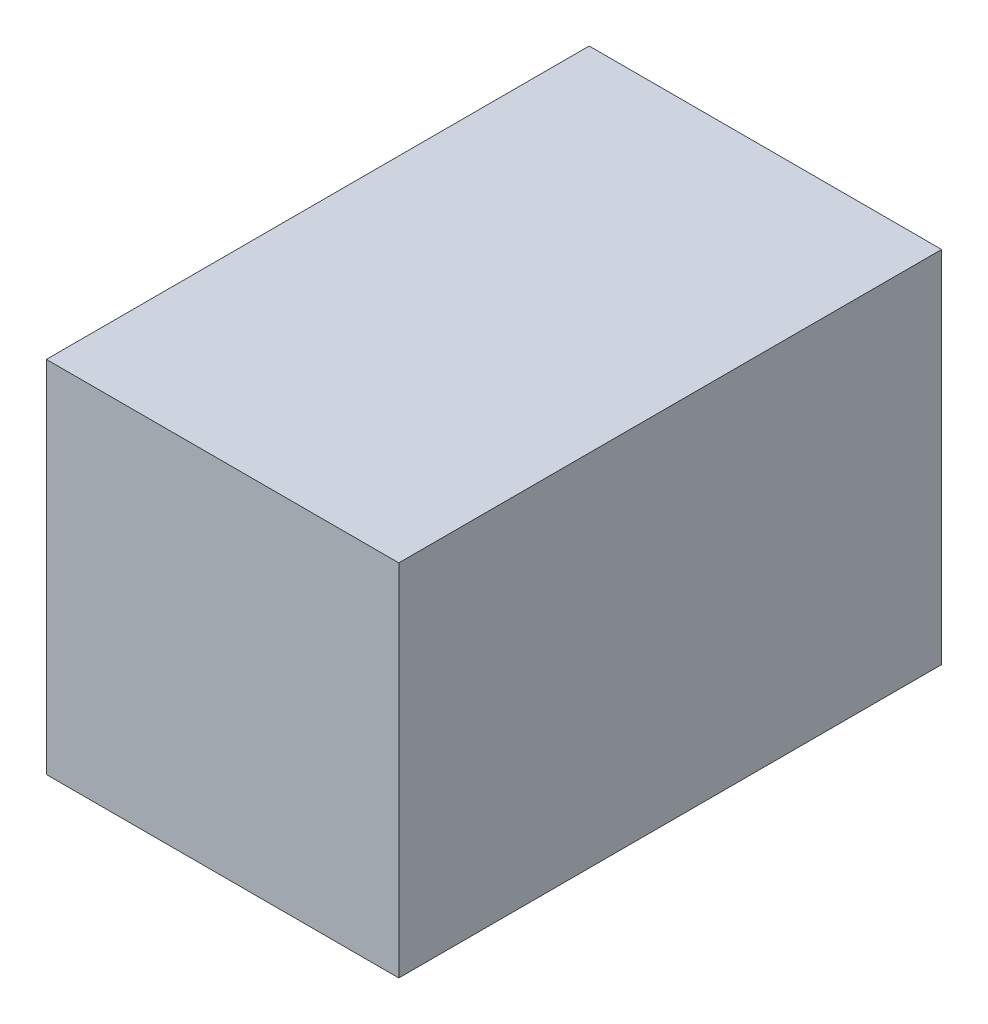
ISO-10303-21;
HEADER;
FILE_DESCRIPTION(('STEP AP214'),'2;1');
FILE_NAME('part.step','',(''),(''),'','','');
FILE_SCHEMA(('AUTOMOTIVE_DESIGN { 1 0 10303 214 1 1 1 1 }'));
ENDSEC;
DATA;
#1=APPLICATION_CONTEXT('core data for automotive mechanical design processes');
#2=APPLICATION_PROTOCOL_DEFINITION('international standard','automotive_design',2000,#1);
#3=PRODUCT_CONTEXT('',#1,'mechanical');
#4=PRODUCT('Part','Part','',(#3));
#5=PRODUCT_RELATED_PRODUCT_CATEGORY('part','',(#4));
#6=PRODUCT_DEFINITION_FORMATION('','',#4);
#7=PRODUCT_DEFINITION_CONTEXT('part definition',#1,'design');
#8=PRODUCT_DEFINITION('design','',#6,#7);
#9=PRODUCT_DEFINITION_SHAPE('','',#8);
#10=(LENGTH_UNIT() NAMED_UNIT(*) SI_UNIT(.MILLI.,.METRE.));
#11=(NAMED_UNIT(*) PLANE_ANGLE_UNIT() SI_UNIT($,.RADIAN.));
#12=(NAMED_UNIT(*) SI_UNIT($,.STERADIAN.) SOLID_ANGLE_UNIT());
#13=UNCERTAINTY_MEASURE_WITH_UNIT(LENGTH_MEASURE(1.E-05),#10,'distance_accuracy_value','');
#14=(GEOMETRIC_REPRESENTATION_CONTEXT(3) GLOBAL_UNCERTAINTY_ASSIGNED_CONTEXT((#13)) GLOBAL_UNIT_ASSIGNED_CONTEXT((#10,
#11,#12)) REPRESENTATION_CONTEXT('',''));
#15=CARTESIAN_POINT('',(0.,0.,0.));
#16=DIRECTION('',(0.,0.,1.));
#17=DIRECTION('',(1.,0.,0.));
#18=AXIS2_PLACEMENT_3D('',#15,#16,#17);
#19=CARTESIAN_POINT('',(-12.2,32.75,-53.6));
#20=DIRECTION('',(0.,0.,-1.));
#21=DIRECTION('',(-1.,0.,0.));
#22=AXIS2_PLACEMENT_3D('',#19,#20,#21);
#23=PLANE('',#22);
#24=DIRECTION('',(0.,-1.,0.));
#25=VECTOR('',#24,1.);
#26=CARTESIAN_POINT('',(-17.4,32.75,-53.6));
#27=LINE('',#26,#25);
#28=CARTESIAN_POINT('',(-17.4,32.75,-53.6));
#29=VERTEX_POINT('',#28);
#30=CARTESIAN_POINT('',(-17.4,-2.75,-53.6));
#31=VERTEX_POINT('',#30);
#32=EDGE_CURVE('E53',#29,#31,#27,.T.);
#33=ORIENTED_EDGE('',*,*,#32,.F.);
#34=DIRECTION('',(-1.,0.,0.));
#35=VECTOR('',#34,1.);
#36=CARTESIAN_POINT('',(17.4,32.75,-53.6));
#37=LINE('',#36,#35);
#38=CARTESIAN_POINT('',(17.4,32.75,-53.6));
#39=VERTEX_POINT('',#38);
#40=EDGE_CURVE('E76',#39,#29,#37,.T.);
#41=ORIENTED_EDGE('',*,*,#40,.F.);
#42=DIRECTION('',(0.,1.,0.));
#43=VECTOR('',#42,1.);
#44=CARTESIAN_POINT('',(17.4,-2.75,-53.6));
#45=LINE('',#44,#43);
#46=CARTESIAN_POINT('',(17.4,-2.75,-53.6));
#47=VERTEX_POINT('',#46);
#48=EDGE_CURVE('E81',#47,#39,#45,.T.);
#49=ORIENTED_EDGE('',*,*,#48,.F.);
#50=DIRECTION('',(1.,0.,0.));
#51=VECTOR('',#50,1.);
#52=CARTESIAN_POINT('',(-17.4,-2.75,-53.6));
#53=LINE('',#52,#51);
#54=EDGE_CURVE('E96',#31,#47,#53,.T.);
#55=ORIENTED_EDGE('',*,*,#54,.F.);
#56=EDGE_LOOP('',(#33,#41,#49,#55));
#57=FACE_BOUND('',#56,.T.);
#58=ADVANCED_FACE('F45',(#57),#23,.T.);
#59=CARTESIAN_POINT('',(0.,0.,0.));
#60=DIRECTION('',(0.,0.,1.));
#61=DIRECTION('',(1.,0.,0.));
#62=AXIS2_PLACEMENT_3D('',#59,#60,#61);
#63=PLANE('',#62);
#64=DIRECTION('',(0.,-1.,0.));
#65=VECTOR('',#64,1.);
#66=CARTESIAN_POINT('',(-17.4,32.75,0.));
#67=LINE('',#66,#65);
#68=CARTESIAN_POINT('',(-17.4,32.75,0.));
#69=VERTEX_POINT('',#68);
#70=CARTESIAN_POINT('',(-17.4,-2.75,0.));
#71=VERTEX_POINT('',#70);
#72=EDGE_CURVE('E105',#69,#71,#67,.T.);
#73=ORIENTED_EDGE('',*,*,#72,.T.);
#74=DIRECTION('',(1.,0.,0.));
#75=VECTOR('',#74,1.);
#76=CARTESIAN_POINT('',(-17.4,-2.75,0.));
#77=LINE('',#76,#75);
#78=CARTESIAN_POINT('',(17.4,-2.75,0.));
#79=VERTEX_POINT('',#78);
#80=EDGE_CURVE('E94',#71,#79,#77,.T.);
#81=ORIENTED_EDGE('',*,*,#80,.T.);
#82=DIRECTION('',(0.,1.,0.));
#83=VECTOR('',#82,1.);
#84=CARTESIAN_POINT('',(17.4,-2.75,0.));
#85=LINE('',#84,#83);
#86=CARTESIAN_POINT('',(17.4,32.75,0.));
#87=VERTEX_POINT('',#86);
#88=EDGE_CURVE('E97',#79,#87,#85,.T.);
#89=ORIENTED_EDGE('',*,*,#88,.T.);
#90=DIRECTION('',(-1.,0.,0.));
#91=VECTOR('',#90,1.);
#92=CARTESIAN_POINT('',(17.4,32.75,0.));
#93=LINE('',#92,#91);
#94=EDGE_CURVE('E102',#87,#69,#93,.T.);
#95=ORIENTED_EDGE('',*,*,#94,.T.);
#96=EDGE_LOOP('',(#73,#81,#89,#95));
#97=FACE_BOUND('',#96,.T.);
#98=ADVANCED_FACE('F104',(#97),#63,.T.);
#99=CARTESIAN_POINT('',(-17.4,-2.75,-103.31207096873));
#100=DIRECTION('',(0.,-1.,0.));
#101=DIRECTION('',(0.,0.,-1.));
#102=AXIS2_PLACEMENT_3D('',#99,#100,#101);
#103=PLANE('',#102);
#104=DIRECTION('',(0.,0.,1.));
#105=VECTOR('',#104,1.);
#106=CARTESIAN_POINT('',(-17.4,-2.75,-103.31207096873));
#107=LINE('',#106,#105);
#108=EDGE_CURVE('E11',#31,#71,#107,.T.);
#109=ORIENTED_EDGE('',*,*,#108,.F.);
#110=ORIENTED_EDGE('',*,*,#54,.T.);
#111=DIRECTION('',(0.,0.,1.));
#112=VECTOR('',#111,1.);
#113=CARTESIAN_POINT('',(17.4,-2.75,-103.31207096873));
#114=LINE('',#113,#112);
#115=EDGE_CURVE('E91',#47,#79,#114,.T.);
#116=ORIENTED_EDGE('',*,*,#115,.T.);
#117=ORIENTED_EDGE('',*,*,#80,.F.);
#118=EDGE_LOOP('',(#109,#110,#116,#117));
#119=FACE_BOUND('',#118,.T.);
#120=ADVANCED_FACE('F92',(#119),#103,.T.);
#121=CARTESIAN_POINT('',(17.4,-2.75,-103.31207096873));
#122=DIRECTION('',(1.,0.,0.));
#123=DIRECTION('',(0.,0.,-1.));
#124=AXIS2_PLACEMENT_3D('',#121,#122,#123);
#125=PLANE('',#124);
#126=ORIENTED_EDGE('',*,*,#115,.F.);
#127=ORIENTED_EDGE('',*,*,#48,.T.);
#128=DIRECTION('',(0.,0.,1.));
#129=VECTOR('',#128,1.);
#130=CARTESIAN_POINT('',(17.4,32.75,-103.31207096873));
#131=LINE('',#130,#129);
#132=EDGE_CURVE('E86',#39,#87,#131,.T.);
#133=ORIENTED_EDGE('',*,*,#132,.T.);
#134=ORIENTED_EDGE('',*,*,#88,.F.);
#135=EDGE_LOOP('',(#126,#127,#133,#134));
#136=FACE_BOUND('',#135,.T.);
#137=ADVANCED_FACE('F98',(#136),#125,.T.);
#138=CARTESIAN_POINT('',(17.4,32.75,-103.31207096873));
#139=DIRECTION('',(0.,1.,0.));
#140=DIRECTION('',(0.,0.,1.));
#141=AXIS2_PLACEMENT_3D('',#138,#139,#140);
#142=PLANE('',#141);
#143=ORIENTED_EDGE('',*,*,#132,.F.);
#144=ORIENTED_EDGE('',*,*,#40,.T.);
#145=DIRECTION('',(0.,0.,1.));
#146=VECTOR('',#145,1.);
#147=CARTESIAN_POINT('',(-17.4,32.75,-103.31207096873));
#148=LINE('',#147,#146);
#149=EDGE_CURVE('E112',#29,#69,#148,.T.);
#150=ORIENTED_EDGE('',*,*,#149,.T.);
#151=ORIENTED_EDGE('',*,*,#94,.F.);
#152=EDGE_LOOP('',(#143,#144,#150,#151));
#153=FACE_BOUND('',#152,.T.);
#154=ADVANCED_FACE('F118',(#153),#142,.T.);
#155=CARTESIAN_POINT('',(-17.4,32.75,-103.31207096873));
#156=DIRECTION('',(-1.,0.,0.));
#157=DIRECTION('',(0.,0.,1.));
#158=AXIS2_PLACEMENT_3D('',#155,#156,#157);
#159=PLANE('',#158);
#160=ORIENTED_EDGE('',*,*,#149,.F.);
#161=ORIENTED_EDGE('',*,*,#32,.T.);
#162=ORIENTED_EDGE('',*,*,#108,.T.);
#163=ORIENTED_EDGE('',*,*,#72,.F.);
#164=EDGE_LOOP('',(#160,#161,#162,#163));
#165=FACE_BOUND('',#164,.T.);
#166=ADVANCED_FACE('F119',(#165),#159,.T.);
#167=CLOSED_SHELL('',(#58,#98,#120,#137,#154,#166));
#168=MANIFOLD_SOLID_BREP('B2',#167);
#169=ADVANCED_BREP_SHAPE_REPRESENTATION('',(#18,#168),#14);
#170=SHAPE_DEFINITION_REPRESENTATION(#9,#169);
ENDSEC;
END-ISO-10303-21;
